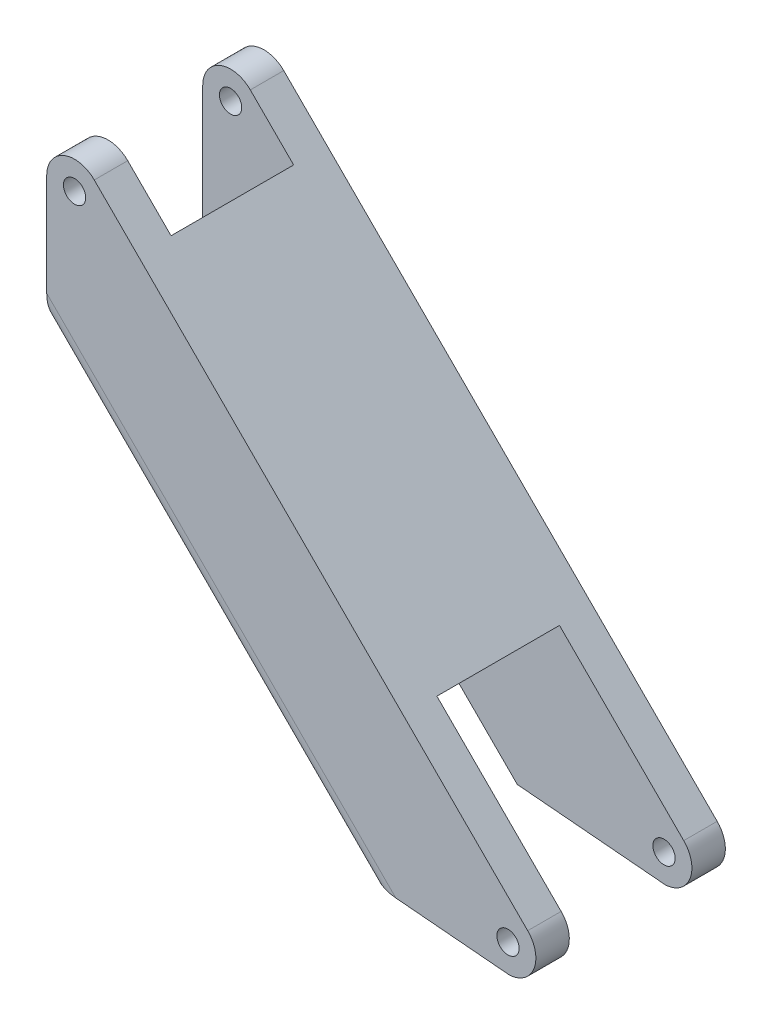
ISO-10303-21;
HEADER;
FILE_DESCRIPTION(('STEP AP214'),'2;1');
FILE_NAME('part.step','',(''),(''),'','','');
FILE_SCHEMA(('AUTOMOTIVE_DESIGN { 1 0 10303 214 1 1 1 1 }'));
ENDSEC;
DATA;
#1=APPLICATION_CONTEXT('core data for automotive mechanical design processes');
#2=APPLICATION_PROTOCOL_DEFINITION('international standard','automotive_design',2000,#1);
#3=PRODUCT_CONTEXT('',#1,'mechanical');
#4=PRODUCT('Part','Part','',(#3));
#5=PRODUCT_RELATED_PRODUCT_CATEGORY('part','',(#4));
#6=PRODUCT_DEFINITION_FORMATION('','',#4);
#7=PRODUCT_DEFINITION_CONTEXT('part definition',#1,'design');
#8=PRODUCT_DEFINITION('design','',#6,#7);
#9=PRODUCT_DEFINITION_SHAPE('','',#8);
#10=(LENGTH_UNIT() NAMED_UNIT(*) SI_UNIT(.MILLI.,.METRE.));
#11=(NAMED_UNIT(*) PLANE_ANGLE_UNIT() SI_UNIT($,.RADIAN.));
#12=(NAMED_UNIT(*) SI_UNIT($,.STERADIAN.) SOLID_ANGLE_UNIT());
#13=UNCERTAINTY_MEASURE_WITH_UNIT(LENGTH_MEASURE(1.E-05),#10,'distance_accuracy_value','');
#14=(GEOMETRIC_REPRESENTATION_CONTEXT(3) GLOBAL_UNCERTAINTY_ASSIGNED_CONTEXT((#13)) GLOBAL_UNIT_ASSIGNED_CONTEXT((#10,
#11,#12)) REPRESENTATION_CONTEXT('',''));
#15=CARTESIAN_POINT('',(0.,0.,0.));
#16=DIRECTION('',(0.,0.,1.));
#17=DIRECTION('',(1.,0.,0.));
#18=AXIS2_PLACEMENT_3D('',#15,#16,#17);
#19=CARTESIAN_POINT('',(-18.6655365987259,0.,17.));
#20=DIRECTION('',(1.,0.,0.));
#21=DIRECTION('',(0.,1.,0.));
#22=AXIS2_PLACEMENT_3D('',#19,#20,#21);
#23=PLANE('',#22);
#24=DIRECTION('',(0.,-1.,0.));
#25=VECTOR('',#24,1.);
#26=CARTESIAN_POINT('',(-18.6655365987259,0.,0.));
#27=LINE('',#26,#25);
#28=CARTESIAN_POINT('',(-18.6655365987259,52.9408964097891,0.));
#29=VERTEX_POINT('',#28);
#30=CARTESIAN_POINT('',(-18.6655365987259,43.7693235345353,0.));
#31=VERTEX_POINT('',#30);
#32=EDGE_CURVE('E257',#29,#31,#27,.T.);
#33=ORIENTED_EDGE('',*,*,#32,.T.);
#34=CARTESIAN_POINT('',(-18.6655365987259,43.7693235345353,2.));
#35=DIRECTION('',(1.,0.,0.));
#36=DIRECTION('',(0.,-1.,0.));
#37=AXIS2_PLACEMENT_3D('',#34,#35,#36);
#38=ELLIPSE('',#37,2.82842712474618,2.);
#39=CARTESIAN_POINT('',(-18.6655365987259,40.9408964097891,2.));
#40=VERTEX_POINT('',#39);
#41=EDGE_CURVE('E13',#31,#40,#38,.F.);
#42=ORIENTED_EDGE('',*,*,#41,.T.);
#43=DIRECTION('',(0.,0.,-1.));
#44=VECTOR('',#43,1.);
#45=CARTESIAN_POINT('',(-18.6655365987259,40.9408964097891,17.));
#46=LINE('',#45,#44);
#47=CARTESIAN_POINT('',(-18.6655365987259,40.9408964097891,3.));
#48=VERTEX_POINT('',#47);
#49=EDGE_CURVE('E294',#48,#40,#46,.T.);
#50=ORIENTED_EDGE('',*,*,#49,.F.);
#51=DIRECTION('',(0.,1.,0.));
#52=VECTOR('',#51,1.);
#53=CARTESIAN_POINT('',(-18.6655365987259,0.,3.));
#54=LINE('',#53,#52);
#55=CARTESIAN_POINT('',(-18.6655365987259,52.9408964097891,3.));
#56=VERTEX_POINT('',#55);
#57=EDGE_CURVE('E239',#48,#56,#54,.T.);
#58=ORIENTED_EDGE('',*,*,#57,.T.);
#59=DIRECTION('',(0.,0.,-1.));
#60=VECTOR('',#59,1.);
#61=CARTESIAN_POINT('',(-18.6655365987259,52.9408964097891,17.));
#62=LINE('',#61,#60);
#63=EDGE_CURVE('E297',#56,#29,#62,.T.);
#64=ORIENTED_EDGE('',*,*,#63,.T.);
#65=EDGE_LOOP('',(#33,#42,#50,#58,#64));
#66=FACE_BOUND('',#65,.T.);
#67=ADVANCED_FACE('F49',(#66),#23,.F.);
#68=CARTESIAN_POINT('',(11.1376799055317,11.1376799055318,17.));
#69=DIRECTION('',(0.707106781186544,0.707106781186551,0.));
#70=DIRECTION('',(-0.707106781186551,0.707106781186544,0.));
#71=AXIS2_PLACEMENT_3D('',#68,#69,#70);
#72=PLANE('',#71);
#73=ORIENTED_EDGE('',*,*,#49,.T.);
#74=DIRECTION('',(0.707106781186551,-0.707106781186544,0.));
#75=VECTOR('',#74,1.);
#76=CARTESIAN_POINT('',(11.1376799055317,11.1376799055318,2.));
#77=LINE('',#76,#75);
#78=CARTESIAN_POINT('',(9.56111441971268,12.7142453913509,2.));
#79=VERTEX_POINT('',#78);
#80=EDGE_CURVE('E331',#40,#79,#77,.T.);
#81=ORIENTED_EDGE('',*,*,#80,.T.);
#82=DIRECTION('',(0.,0.,-1.));
#83=VECTOR('',#82,1.);
#84=CARTESIAN_POINT('',(9.56111441971268,12.7142453913509,17.));
#85=LINE('',#84,#83);
#86=CARTESIAN_POINT('',(9.56111441971265,12.7142453913509,3.));
#87=VERTEX_POINT('',#86);
#88=EDGE_CURVE('E274',#87,#79,#85,.T.);
#89=ORIENTED_EDGE('',*,*,#88,.F.);
#90=DIRECTION('',(-0.707106781186551,0.707106781186544,0.));
#91=VECTOR('',#90,1.);
#92=CARTESIAN_POINT('',(11.1376799055317,11.1376799055318,3.));
#93=LINE('',#92,#91);
#94=EDGE_CURVE('E313',#87,#48,#93,.T.);
#95=ORIENTED_EDGE('',*,*,#94,.T.);
#96=EDGE_LOOP('',(#73,#81,#89,#95));
#97=FACE_BOUND('',#96,.T.);
#98=ADVANCED_FACE('F338',(#97),#72,.F.);
#99=CARTESIAN_POINT('',(1.17653017718053,13.4478014609505,17.));
#100=DIRECTION('',(-0.0871557427476584,-0.996194698091746,0.));
#101=DIRECTION('',(0.996194698091746,-0.0871557427476584,0.));
#102=AXIS2_PLACEMENT_3D('',#99,#100,#101);
#103=PLANE('',#102);
#104=DIRECTION('',(-0.996194698091746,0.0871557427476584,0.));
#105=VECTOR('',#104,1.);
#106=CARTESIAN_POINT('',(1.17653017718053,13.4478014609505,17.));
#107=LINE('',#106,#105);
#108=CARTESIAN_POINT('',(22.8387913795427,11.5525991794064,17.));
#109=VERTEX_POINT('',#108);
#110=CARTESIAN_POINT('',(12.6607220757394,12.4430648600704,17.));
#111=VERTEX_POINT('',#110);
#112=EDGE_CURVE('E260',#109,#111,#107,.T.);
#113=ORIENTED_EDGE('',*,*,#112,.T.);
#114=CARTESIAN_POINT('',(12.6607220757394,12.4430648600704,15.));
#115=DIRECTION('',(-0.0871557427476584,-0.996194698091746,0.));
#116=DIRECTION('',(-0.996194698091746,0.0871557427476584,0.));
#117=AXIS2_PLACEMENT_3D('',#114,#115,#116);
#118=ELLIPSE('',#117,3.11144765372084,2.);
#119=CARTESIAN_POINT('',(9.56111441971268,12.7142453913509,15.));
#120=VERTEX_POINT('',#119);
#121=EDGE_CURVE('E325',#111,#120,#118,.T.);
#122=ORIENTED_EDGE('',*,*,#121,.T.);
#123=CARTESIAN_POINT('',(9.56111441971265,12.7142453913509,14.));
#124=VERTEX_POINT('',#123);
#125=EDGE_CURVE('E292',#120,#124,#85,.T.);
#126=ORIENTED_EDGE('',*,*,#125,.T.);
#127=DIRECTION('',(-0.996194698091746,0.0871557427476584,0.));
#128=VECTOR('',#127,1.);
#129=CARTESIAN_POINT('',(1.17653017718053,13.4478014609505,14.));
#130=LINE('',#129,#128);
#131=CARTESIAN_POINT('',(22.8387913795427,11.5525991794064,14.));
#132=VERTEX_POINT('',#131);
#133=EDGE_CURVE('E229',#132,#124,#130,.T.);
#134=ORIENTED_EDGE('',*,*,#133,.F.);
#135=DIRECTION('',(0.,0.,-1.));
#136=VECTOR('',#135,1.);
#137=CARTESIAN_POINT('',(22.8387913795427,11.5525991794064,17.));
#138=LINE('',#137,#136);
#139=EDGE_CURVE('E310',#109,#132,#138,.T.);
#140=ORIENTED_EDGE('',*,*,#139,.F.);
#141=EDGE_LOOP('',(#113,#122,#126,#134,#140));
#142=FACE_BOUND('',#141,.T.);
#143=ADVANCED_FACE('F406',(#142),#103,.T.);
#144=CARTESIAN_POINT('',(22.7253363665345,14.0500234445292,17.));
#145=DIRECTION('',(0.,0.,-1.));
#146=DIRECTION('',(-1.,0.,0.));
#147=AXIS2_PLACEMENT_3D('',#144,#145,#146);
#148=CYLINDRICAL_SURFACE('',#147,2.50000000000023);
#149=ORIENTED_EDGE('',*,*,#139,.T.);
#150=CARTESIAN_POINT('',(22.7253363665345,14.0500234445292,14.));
#151=DIRECTION('',(0.,0.,1.));
#152=DIRECTION('',(1.,0.,0.));
#153=AXIS2_PLACEMENT_3D('',#150,#151,#152);
#154=CIRCLE('',#153,2.50000000000023);
#155=CARTESIAN_POINT('',(24.4931033195011,15.8177903974958,14.));
#156=VERTEX_POINT('',#155);
#157=EDGE_CURVE('E232',#132,#156,#154,.T.);
#158=ORIENTED_EDGE('',*,*,#157,.T.);
#159=DIRECTION('',(0.,0.,-1.));
#160=VECTOR('',#159,1.);
#161=CARTESIAN_POINT('',(24.4931033195011,15.8177903974958,17.));
#162=LINE('',#161,#160);
#163=CARTESIAN_POINT('',(24.4931033195011,15.8177903974958,17.));
#164=VERTEX_POINT('',#163);
#165=EDGE_CURVE('E306',#164,#156,#162,.T.);
#166=ORIENTED_EDGE('',*,*,#165,.F.);
#167=CARTESIAN_POINT('',(22.7253363665345,14.0500234445292,17.));
#168=DIRECTION('',(0.,0.,1.));
#169=DIRECTION('',(1.,0.,0.));
#170=AXIS2_PLACEMENT_3D('',#167,#168,#169);
#171=CIRCLE('',#170,2.50000000000023);
#172=EDGE_CURVE('E263',#109,#164,#171,.T.);
#173=ORIENTED_EDGE('',*,*,#172,.F.);
#174=EDGE_LOOP('',(#149,#158,#166,#173));
#175=FACE_BOUND('',#174,.T.);
#176=ADVANCED_FACE('F437',(#175),#148,.T.);
#177=CARTESIAN_POINT('',(-16.1655365987258,52.9408964097891,17.));
#178=DIRECTION('',(0.,0.,-1.));
#179=DIRECTION('',(-1.,0.,0.));
#180=AXIS2_PLACEMENT_3D('',#177,#178,#179);
#181=CYLINDRICAL_SURFACE('',#180,2.5000000000001);
#182=DIRECTION('',(0.,0.,-1.));
#183=VECTOR('',#182,1.);
#184=CARTESIAN_POINT('',(-14.3977696457594,54.7086633627556,17.));
#185=LINE('',#184,#183);
#186=CARTESIAN_POINT('',(-14.3977696457594,54.7086633627556,17.));
#187=VERTEX_POINT('',#186);
#188=CARTESIAN_POINT('',(-14.3977696457593,54.7086633627557,14.));
#189=VERTEX_POINT('',#188);
#190=EDGE_CURVE('E302',#187,#189,#185,.T.);
#191=ORIENTED_EDGE('',*,*,#190,.T.);
#192=CARTESIAN_POINT('',(-16.1655365987258,52.9408964097891,14.));
#193=DIRECTION('',(0.,0.,1.));
#194=DIRECTION('',(1.,0.,0.));
#195=AXIS2_PLACEMENT_3D('',#192,#193,#194);
#196=CIRCLE('',#195,2.5000000000001);
#197=CARTESIAN_POINT('',(-18.6655365987259,52.9408964097891,14.));
#198=VERTEX_POINT('',#197);
#199=EDGE_CURVE('E249',#189,#198,#196,.T.);
#200=ORIENTED_EDGE('',*,*,#199,.T.);
#201=CARTESIAN_POINT('',(-18.6655365987259,52.9408964097891,17.));
#202=VERTEX_POINT('',#201);
#203=EDGE_CURVE('E298',#202,#198,#62,.T.);
#204=ORIENTED_EDGE('',*,*,#203,.F.);
#205=CARTESIAN_POINT('',(-16.1655365987258,52.9408964097891,17.));
#206=DIRECTION('',(0.,0.,1.));
#207=DIRECTION('',(1.,0.,0.));
#208=AXIS2_PLACEMENT_3D('',#205,#206,#207);
#209=CIRCLE('',#208,2.5000000000001);
#210=EDGE_CURVE('E268',#187,#202,#209,.T.);
#211=ORIENTED_EDGE('',*,*,#210,.F.);
#212=EDGE_LOOP('',(#191,#200,#204,#211));
#213=FACE_BOUND('',#212,.T.);
#214=ADVANCED_FACE('F421',(#213),#181,.T.);
#215=CARTESIAN_POINT('',(22.7253363665345,14.0500234445292,17.));
#216=DIRECTION('',(0.,0.,-1.));
#217=DIRECTION('',(-1.,0.,0.));
#218=AXIS2_PLACEMENT_3D('',#215,#216,#217);
#219=CYLINDRICAL_SURFACE('',#218,1.);
#220=CARTESIAN_POINT('',(22.7253363665345,14.0500234445292,14.));
#221=DIRECTION('',(0.,0.,1.));
#222=DIRECTION('',(1.,0.,0.));
#223=AXIS2_PLACEMENT_3D('',#220,#221,#222);
#224=CIRCLE('',#223,1.);
#225=CARTESIAN_POINT('',(23.7253363665345,14.0500234445292,14.));
#226=VERTEX_POINT('',#225);
#227=EDGE_CURVE('E235',#226,#226,#224,.T.);
#228=ORIENTED_EDGE('',*,*,#227,.F.);
#229=EDGE_LOOP('',(#228));
#230=FACE_BOUND('',#229,.T.);
#231=CARTESIAN_POINT('',(22.7253363665345,14.0500234445292,17.));
#232=DIRECTION('',(0.,0.,1.));
#233=DIRECTION('',(1.,0.,0.));
#234=AXIS2_PLACEMENT_3D('',#231,#232,#233);
#235=CIRCLE('',#234,1.);
#236=CARTESIAN_POINT('',(23.7253363665345,14.0500234445292,17.));
#237=VERTEX_POINT('',#236);
#238=EDGE_CURVE('E256',#237,#237,#235,.T.);
#239=ORIENTED_EDGE('',*,*,#238,.T.);
#240=EDGE_LOOP('',(#239));
#241=FACE_BOUND('',#240,.T.);
#242=ADVANCED_FACE('F420',(#230,#241),#219,.F.);
#243=CARTESIAN_POINT('',(-16.1655365987258,52.9408964097891,17.));
#244=DIRECTION('',(0.,0.,-1.));
#245=DIRECTION('',(-1.,0.,0.));
#246=AXIS2_PLACEMENT_3D('',#243,#244,#245);
#247=CYLINDRICAL_SURFACE('',#246,1.00000000000001);
#248=CARTESIAN_POINT('',(-16.1655365987258,52.9408964097891,14.));
#249=DIRECTION('',(0.,0.,1.));
#250=DIRECTION('',(1.,0.,0.));
#251=AXIS2_PLACEMENT_3D('',#248,#249,#250);
#252=CIRCLE('',#251,1.00000000000001);
#253=CARTESIAN_POINT('',(-15.1655365987258,52.9408964097891,14.));
#254=VERTEX_POINT('',#253);
#255=EDGE_CURVE('E245',#254,#254,#252,.T.);
#256=ORIENTED_EDGE('',*,*,#255,.F.);
#257=EDGE_LOOP('',(#256));
#258=FACE_BOUND('',#257,.T.);
#259=CARTESIAN_POINT('',(-16.1655365987258,52.9408964097891,17.));
#260=DIRECTION('',(0.,0.,1.));
#261=DIRECTION('',(1.,0.,0.));
#262=AXIS2_PLACEMENT_3D('',#259,#260,#261);
#263=CIRCLE('',#262,1.00000000000001);
#264=CARTESIAN_POINT('',(-15.1655365987258,52.9408964097891,17.));
#265=VERTEX_POINT('',#264);
#266=EDGE_CURVE('E253',#265,#265,#263,.T.);
#267=ORIENTED_EDGE('',*,*,#266,.T.);
#268=EDGE_LOOP('',(#267));
#269=FACE_BOUND('',#268,.T.);
#270=ADVANCED_FACE('F451',(#258,#269),#247,.F.);
#271=ORIENTED_EDGE('',*,*,#88,.T.);
#272=CARTESIAN_POINT('',(12.6607220757394,12.4430648600704,2.));
#273=DIRECTION('',(-0.0871557427476584,-0.996194698091746,0.));
#274=DIRECTION('',(0.996194698091746,-0.0871557427476584,0.));
#275=AXIS2_PLACEMENT_3D('',#272,#273,#274);
#276=ELLIPSE('',#275,3.11144765372084,2.);
#277=CARTESIAN_POINT('',(12.6607220757394,12.4430648600704,0.));
#278=VERTEX_POINT('',#277);
#279=EDGE_CURVE('E71',#79,#278,#276,.T.);
#280=ORIENTED_EDGE('',*,*,#279,.T.);
#281=DIRECTION('',(-0.996194698091746,0.0871557427476584,0.));
#282=VECTOR('',#281,1.);
#283=CARTESIAN_POINT('',(1.17653017718053,13.4478014609505,0.));
#284=LINE('',#283,#282);
#285=CARTESIAN_POINT('',(22.8387913795427,11.5525991794064,0.));
#286=VERTEX_POINT('',#285);
#287=EDGE_CURVE('E280',#286,#278,#284,.T.);
#288=ORIENTED_EDGE('',*,*,#287,.F.);
#289=CARTESIAN_POINT('',(22.8387913795427,11.5525991794064,3.));
#290=VERTEX_POINT('',#289);
#291=EDGE_CURVE('E309',#290,#286,#138,.T.);
#292=ORIENTED_EDGE('',*,*,#291,.F.);
#293=DIRECTION('',(0.996194698091746,-0.0871557427476584,0.));
#294=VECTOR('',#293,1.);
#295=CARTESIAN_POINT('',(1.17653017718053,13.4478014609505,3.));
#296=LINE('',#295,#294);
#297=EDGE_CURVE('E220',#87,#290,#296,.T.);
#298=ORIENTED_EDGE('',*,*,#297,.F.);
#299=EDGE_LOOP('',(#271,#280,#288,#292,#298));
#300=FACE_BOUND('',#299,.T.);
#301=ADVANCED_FACE('F343',(#300),#103,.T.);
#302=CARTESIAN_POINT('',(24.4931033195011,15.8177903974958,3.));
#303=VERTEX_POINT('',#302);
#304=CARTESIAN_POINT('',(24.4931033195011,15.8177903974958,0.));
#305=VERTEX_POINT('',#304);
#306=EDGE_CURVE('E305',#303,#305,#162,.T.);
#307=ORIENTED_EDGE('',*,*,#306,.F.);
#308=CARTESIAN_POINT('',(22.7253363665345,14.0500234445292,3.));
#309=DIRECTION('',(0.,0.,-1.));
#310=DIRECTION('',(-1.,0.,0.));
#311=AXIS2_PLACEMENT_3D('',#308,#309,#310);
#312=CIRCLE('',#311,2.50000000000023);
#313=EDGE_CURVE('E222',#303,#290,#312,.T.);
#314=ORIENTED_EDGE('',*,*,#313,.T.);
#315=ORIENTED_EDGE('',*,*,#291,.T.);
#316=CARTESIAN_POINT('',(22.7253363665345,14.0500234445292,0.));
#317=DIRECTION('',(0.,0.,1.));
#318=DIRECTION('',(1.,0.,0.));
#319=AXIS2_PLACEMENT_3D('',#316,#317,#318);
#320=CIRCLE('',#319,2.50000000000023);
#321=EDGE_CURVE('E282',#286,#305,#320,.T.);
#322=ORIENTED_EDGE('',*,*,#321,.T.);
#323=EDGE_LOOP('',(#307,#314,#315,#322));
#324=FACE_BOUND('',#323,.T.);
#325=ADVANCED_FACE('F352',(#324),#148,.T.);
#326=CARTESIAN_POINT('',(20.1554468584983,20.1554468584985,17.));
#327=DIRECTION('',(0.707106781186544,0.707106781186552,0.));
#328=DIRECTION('',(-0.707106781186551,0.707106781186544,0.));
#329=AXIS2_PLACEMENT_3D('',#326,#327,#328);
#330=PLANE('',#329);
#331=DIRECTION('',(0.707106781186551,-0.707106781186543,0.));
#332=VECTOR('',#331,1.);
#333=CARTESIAN_POINT('',(2.19403787867576,38.1168558383208,14.));
#334=LINE('',#333,#332);
#335=CARTESIAN_POINT('',(13.3435705990884,26.9673231179083,14.));
#336=VERTEX_POINT('',#335);
#337=EDGE_CURVE('E214',#336,#156,#334,.T.);
#338=ORIENTED_EDGE('',*,*,#337,.F.);
#339=DIRECTION('',(0.,0.,-1.));
#340=VECTOR('',#339,1.);
#341=CARTESIAN_POINT('',(13.3435705990884,26.9673231179083,3.));
#342=LINE('',#341,#340);
#343=CARTESIAN_POINT('',(13.3435705990884,26.9673231179083,3.));
#344=VERTEX_POINT('',#343);
#345=EDGE_CURVE('E361',#336,#344,#342,.T.);
#346=ORIENTED_EDGE('',*,*,#345,.T.);
#347=DIRECTION('',(-0.707106781186552,0.707106781186543,0.));
#348=VECTOR('',#347,1.);
#349=CARTESIAN_POINT('',(4.31535822223541,35.9955354947612,3.));
#350=LINE('',#349,#348);
#351=EDGE_CURVE('E212',#303,#344,#350,.T.);
#352=ORIENTED_EDGE('',*,*,#351,.F.);
#353=ORIENTED_EDGE('',*,*,#306,.T.);
#354=DIRECTION('',(0.707106781186551,-0.707106781186544,0.));
#355=VECTOR('',#354,1.);
#356=CARTESIAN_POINT('',(20.1554468584983,20.1554468584985,0.));
#357=LINE('',#356,#355);
#358=CARTESIAN_POINT('',(-14.3977696457594,54.7086633627556,0.));
#359=VERTEX_POINT('',#358);
#360=EDGE_CURVE('E285',#359,#305,#357,.T.);
#361=ORIENTED_EDGE('',*,*,#360,.F.);
#362=CARTESIAN_POINT('',(-14.3977696457593,54.7086633627557,3.));
#363=VERTEX_POINT('',#362);
#364=EDGE_CURVE('E301',#363,#359,#185,.T.);
#365=ORIENTED_EDGE('',*,*,#364,.F.);
#366=DIRECTION('',(-0.707106781186552,0.707106781186543,0.));
#367=VECTOR('',#366,1.);
#368=CARTESIAN_POINT('',(-10.5089841253068,50.8198778423033,3.));
#369=LINE('',#368,#367);
#370=CARTESIAN_POINT('',(-10.5089841253068,50.8198778423033,3.));
#371=VERTEX_POINT('',#370);
#372=EDGE_CURVE('E385',#371,#363,#369,.T.);
#373=ORIENTED_EDGE('',*,*,#372,.F.);
#374=DIRECTION('',(0.,0.,-1.));
#375=VECTOR('',#374,1.);
#376=CARTESIAN_POINT('',(-10.5089841253068,50.8198778423033,14.));
#377=LINE('',#376,#375);
#378=CARTESIAN_POINT('',(-10.5089841253068,50.8198778423033,14.));
#379=VERTEX_POINT('',#378);
#380=EDGE_CURVE('E378',#379,#371,#377,.T.);
#381=ORIENTED_EDGE('',*,*,#380,.F.);
#382=DIRECTION('',(0.707106781186552,-0.707106781186543,0.));
#383=VECTOR('',#382,1.);
#384=CARTESIAN_POINT('',(-22.7633573896774,63.0742511066737,14.));
#385=LINE('',#384,#383);
#386=EDGE_CURVE('E210',#189,#379,#385,.T.);
#387=ORIENTED_EDGE('',*,*,#386,.F.);
#388=ORIENTED_EDGE('',*,*,#190,.F.);
#389=DIRECTION('',(0.707106781186551,-0.707106781186544,0.));
#390=VECTOR('',#389,1.);
#391=CARTESIAN_POINT('',(20.1554468584983,20.1554468584985,17.));
#392=LINE('',#391,#390);
#393=EDGE_CURVE('E265',#187,#164,#392,.T.);
#394=ORIENTED_EDGE('',*,*,#393,.T.);
#395=ORIENTED_EDGE('',*,*,#165,.T.);
#396=EDGE_LOOP('',(#338,#346,#352,#353,#361,#365,#373,#381,#387,#388,#394,#395));
#397=FACE_BOUND('',#396,.T.);
#398=ADVANCED_FACE('F357',(#397),#330,.T.);
#399=ORIENTED_EDGE('',*,*,#63,.F.);
#400=CARTESIAN_POINT('',(-16.1655365987258,52.9408964097891,3.));
#401=DIRECTION('',(0.,0.,-1.));
#402=DIRECTION('',(-1.,0.,0.));
#403=AXIS2_PLACEMENT_3D('',#400,#401,#402);
#404=CIRCLE('',#403,2.5000000000001);
#405=EDGE_CURVE('E242',#56,#363,#404,.T.);
#406=ORIENTED_EDGE('',*,*,#405,.T.);
#407=ORIENTED_EDGE('',*,*,#364,.T.);
#408=CARTESIAN_POINT('',(-16.1655365987258,52.9408964097891,0.));
#409=DIRECTION('',(0.,0.,1.));
#410=DIRECTION('',(1.,0.,0.));
#411=AXIS2_PLACEMENT_3D('',#408,#409,#410);
#412=CIRCLE('',#411,2.5000000000001);
#413=EDGE_CURVE('E288',#359,#29,#412,.T.);
#414=ORIENTED_EDGE('',*,*,#413,.T.);
#415=EDGE_LOOP('',(#399,#406,#407,#414));
#416=FACE_BOUND('',#415,.T.);
#417=ADVANCED_FACE('F389',(#416),#181,.T.);
#418=CARTESIAN_POINT('',(-18.6655365987259,40.9408964097891,15.));
#419=VERTEX_POINT('',#418);
#420=CARTESIAN_POINT('',(-18.6655365987259,40.9408964097891,14.));
#421=VERTEX_POINT('',#420);
#422=EDGE_CURVE('E295',#419,#421,#46,.T.);
#423=ORIENTED_EDGE('',*,*,#422,.F.);
#424=CARTESIAN_POINT('',(-18.6655365987259,43.7693235345353,15.));
#425=DIRECTION('',(1.,0.,0.));
#426=DIRECTION('',(0.,1.,0.));
#427=AXIS2_PLACEMENT_3D('',#424,#425,#426);
#428=ELLIPSE('',#427,2.82842712474618,2.);
#429=CARTESIAN_POINT('',(-18.6655365987259,43.7693235345353,17.));
#430=VERTEX_POINT('',#429);
#431=EDGE_CURVE('E329',#419,#430,#428,.F.);
#432=ORIENTED_EDGE('',*,*,#431,.T.);
#433=DIRECTION('',(0.,-1.,0.));
#434=VECTOR('',#433,1.);
#435=CARTESIAN_POINT('',(-18.6655365987259,0.,17.));
#436=LINE('',#435,#434);
#437=EDGE_CURVE('E271',#202,#430,#436,.T.);
#438=ORIENTED_EDGE('',*,*,#437,.F.);
#439=ORIENTED_EDGE('',*,*,#203,.T.);
#440=DIRECTION('',(0.,-1.,0.));
#441=VECTOR('',#440,1.);
#442=CARTESIAN_POINT('',(-18.6655365987259,0.,14.));
#443=LINE('',#442,#441);
#444=EDGE_CURVE('E246',#198,#421,#443,.T.);
#445=ORIENTED_EDGE('',*,*,#444,.T.);
#446=EDGE_LOOP('',(#423,#432,#438,#439,#445));
#447=FACE_BOUND('',#446,.T.);
#448=ADVANCED_FACE('F402',(#447),#23,.F.);
#449=CARTESIAN_POINT('',(22.7253363665345,14.0500234445292,3.));
#450=DIRECTION('',(0.,0.,-1.));
#451=DIRECTION('',(-1.,0.,0.));
#452=AXIS2_PLACEMENT_3D('',#449,#450,#451);
#453=CIRCLE('',#452,1.);
#454=CARTESIAN_POINT('',(21.7253363665345,14.0500234445292,3.));
#455=VERTEX_POINT('',#454);
#456=EDGE_CURVE('E226',#455,#455,#453,.T.);
#457=ORIENTED_EDGE('',*,*,#456,.F.);
#458=EDGE_LOOP('',(#457));
#459=FACE_BOUND('',#458,.T.);
#460=CARTESIAN_POINT('',(22.7253363665345,14.0500234445292,0.));
#461=DIRECTION('',(0.,0.,1.));
#462=DIRECTION('',(1.,0.,0.));
#463=AXIS2_PLACEMENT_3D('',#460,#461,#462);
#464=CIRCLE('',#463,1.);
#465=CARTESIAN_POINT('',(23.7253363665345,14.0500234445292,0.));
#466=VERTEX_POINT('',#465);
#467=EDGE_CURVE('E277',#466,#466,#464,.T.);
#468=ORIENTED_EDGE('',*,*,#467,.F.);
#469=EDGE_LOOP('',(#468));
#470=FACE_BOUND('',#469,.T.);
#471=ADVANCED_FACE('F411',(#459,#470),#219,.F.);
#472=CARTESIAN_POINT('',(-16.1655365987258,52.9408964097891,3.));
#473=DIRECTION('',(0.,0.,-1.));
#474=DIRECTION('',(-1.,0.,0.));
#475=AXIS2_PLACEMENT_3D('',#472,#473,#474);
#476=CIRCLE('',#475,1.00000000000001);
#477=CARTESIAN_POINT('',(-17.1655365987258,52.9408964097891,3.));
#478=VERTEX_POINT('',#477);
#479=EDGE_CURVE('E238',#478,#478,#476,.T.);
#480=ORIENTED_EDGE('',*,*,#479,.F.);
#481=EDGE_LOOP('',(#480));
#482=FACE_BOUND('',#481,.T.);
#483=CARTESIAN_POINT('',(-16.1655365987258,52.9408964097891,0.));
#484=DIRECTION('',(0.,0.,1.));
#485=DIRECTION('',(1.,0.,0.));
#486=AXIS2_PLACEMENT_3D('',#483,#484,#485);
#487=CIRCLE('',#486,1.00000000000001);
#488=CARTESIAN_POINT('',(-15.1655365987258,52.9408964097891,0.));
#489=VERTEX_POINT('',#488);
#490=EDGE_CURVE('E252',#489,#489,#487,.T.);
#491=ORIENTED_EDGE('',*,*,#490,.F.);
#492=EDGE_LOOP('',(#491));
#493=FACE_BOUND('',#492,.T.);
#494=ADVANCED_FACE('F417',(#482,#493),#247,.F.);
#495=ORIENTED_EDGE('',*,*,#125,.F.);
#496=DIRECTION('',(0.707106781186551,-0.707106781186544,0.));
#497=VECTOR('',#496,1.);
#498=CARTESIAN_POINT('',(-18.6655365987259,40.9408964097891,15.));
#499=LINE('',#498,#497);
#500=EDGE_CURVE('E327',#120,#419,#499,.F.);
#501=ORIENTED_EDGE('',*,*,#500,.T.);
#502=ORIENTED_EDGE('',*,*,#422,.T.);
#503=DIRECTION('',(0.707106781186551,-0.707106781186544,0.));
#504=VECTOR('',#503,1.);
#505=CARTESIAN_POINT('',(11.1376799055317,11.1376799055318,14.));
#506=LINE('',#505,#504);
#507=EDGE_CURVE('E315',#421,#124,#506,.T.);
#508=ORIENTED_EDGE('',*,*,#507,.T.);
#509=EDGE_LOOP('',(#495,#501,#502,#508));
#510=FACE_BOUND('',#509,.T.);
#511=ADVANCED_FACE('F408',(#510),#72,.F.);
#512=CARTESIAN_POINT('',(0.,0.,17.));
#513=DIRECTION('',(0.,0.,1.));
#514=DIRECTION('',(1.,0.,0.));
#515=AXIS2_PLACEMENT_3D('',#512,#513,#514);
#516=PLANE('',#515);
#517=ORIENTED_EDGE('',*,*,#266,.F.);
#518=EDGE_LOOP('',(#517));
#519=FACE_BOUND('',#518,.T.);
#520=ORIENTED_EDGE('',*,*,#238,.F.);
#521=EDGE_LOOP('',(#520));
#522=FACE_BOUND('',#521,.T.);
#523=ORIENTED_EDGE('',*,*,#437,.T.);
#524=DIRECTION('',(0.707106781186551,-0.707106781186544,0.));
#525=VECTOR('',#524,1.);
#526=CARTESIAN_POINT('',(10.9753279820858,14.1284589537239,17.));
#527=LINE('',#526,#525);
#528=EDGE_CURVE('E318',#430,#111,#527,.T.);
#529=ORIENTED_EDGE('',*,*,#528,.T.);
#530=ORIENTED_EDGE('',*,*,#112,.F.);
#531=ORIENTED_EDGE('',*,*,#172,.T.);
#532=ORIENTED_EDGE('',*,*,#393,.F.);
#533=ORIENTED_EDGE('',*,*,#210,.T.);
#534=EDGE_LOOP('',(#523,#529,#530,#531,#532,#533));
#535=FACE_BOUND('',#534,.T.);
#536=ADVANCED_FACE('F430',(#519,#522,#535),#516,.T.);
#537=CARTESIAN_POINT('',(0.,0.,0.));
#538=DIRECTION('',(0.,0.,1.));
#539=DIRECTION('',(1.,0.,0.));
#540=AXIS2_PLACEMENT_3D('',#537,#538,#539);
#541=PLANE('',#540);
#542=ORIENTED_EDGE('',*,*,#490,.T.);
#543=EDGE_LOOP('',(#542));
#544=FACE_BOUND('',#543,.T.);
#545=ORIENTED_EDGE('',*,*,#467,.T.);
#546=EDGE_LOOP('',(#545));
#547=FACE_BOUND('',#546,.T.);
#548=ORIENTED_EDGE('',*,*,#287,.T.);
#549=DIRECTION('',(0.707106781186551,-0.707106781186544,0.));
#550=VECTOR('',#549,1.);
#551=CARTESIAN_POINT('',(12.5518934679048,12.5518934679049,0.));
#552=LINE('',#551,#550);
#553=EDGE_CURVE('E57',#278,#31,#552,.F.);
#554=ORIENTED_EDGE('',*,*,#553,.T.);
#555=ORIENTED_EDGE('',*,*,#32,.F.);
#556=ORIENTED_EDGE('',*,*,#413,.F.);
#557=ORIENTED_EDGE('',*,*,#360,.T.);
#558=ORIENTED_EDGE('',*,*,#321,.F.);
#559=EDGE_LOOP('',(#548,#554,#555,#556,#557,#558));
#560=FACE_BOUND('',#559,.T.);
#561=ADVANCED_FACE('F392',(#544,#547,#560),#541,.F.);
#562=CARTESIAN_POINT('',(-9.82677740149548,26.0960405581494,14.));
#563=DIRECTION('',(0.,0.,1.));
#564=DIRECTION('',(1.,0.,0.));
#565=AXIS2_PLACEMENT_3D('',#562,#563,#564);
#566=PLANE('',#565);
#567=ORIENTED_EDGE('',*,*,#227,.T.);
#568=EDGE_LOOP('',(#567));
#569=FACE_BOUND('',#568,.T.);
#570=DIRECTION('',(0.707106781186551,-0.707106781186544,0.));
#571=VECTOR('',#570,1.);
#572=CARTESIAN_POINT('',(11.9293570367153,25.5531095555352,14.));
#573=LINE('',#572,#571);
#574=CARTESIAN_POINT('',(0.779824316302672,36.7026422759477,14.));
#575=VERTEX_POINT('',#574);
#576=CARTESIAN_POINT('',(11.9293570367153,25.5531095555352,14.));
#577=VERTEX_POINT('',#576);
#578=EDGE_CURVE('E478',#575,#577,#573,.T.);
#579=ORIENTED_EDGE('',*,*,#578,.T.);
#580=DIRECTION('',(0.707106781186543,0.707106781186552,0.));
#581=VECTOR('',#580,1.);
#582=CARTESIAN_POINT('',(11.9293570367153,25.5531095555352,14.));
#583=LINE('',#582,#581);
#584=EDGE_CURVE('E370',#577,#336,#583,.T.);
#585=ORIENTED_EDGE('',*,*,#584,.T.);
#586=ORIENTED_EDGE('',*,*,#337,.T.);
#587=ORIENTED_EDGE('',*,*,#157,.F.);
#588=ORIENTED_EDGE('',*,*,#133,.T.);
#589=ORIENTED_EDGE('',*,*,#507,.F.);
#590=ORIENTED_EDGE('',*,*,#444,.F.);
#591=ORIENTED_EDGE('',*,*,#199,.F.);
#592=ORIENTED_EDGE('',*,*,#386,.T.);
#593=DIRECTION('',(0.707106781186544,0.707106781186552,0.));
#594=VECTOR('',#593,1.);
#595=CARTESIAN_POINT('',(-22.5297994054781,38.7990625621319,14.));
#596=LINE('',#595,#594);
#597=CARTESIAN_POINT('',(-13.5267510782734,47.8021108893367,14.));
#598=VERTEX_POINT('',#597);
#599=EDGE_CURVE('E202',#598,#379,#596,.T.);
#600=ORIENTED_EDGE('',*,*,#599,.F.);
#601=DIRECTION('',(-0.707106781186551,0.707106781186544,0.));
#602=VECTOR('',#601,1.);
#603=CARTESIAN_POINT('',(23.9740484990961,10.3013113119677,14.));
#604=LINE('',#603,#602);
#605=CARTESIAN_POINT('',(-0.823729074290786,35.0990888853542,14.));
#606=VERTEX_POINT('',#605);
#607=EDGE_CURVE('E185',#606,#598,#604,.T.);
#608=ORIENTED_EDGE('',*,*,#607,.F.);
#609=DIRECTION('',(0.707106781186544,0.707106781186552,0.));
#610=VECTOR('',#609,1.);
#611=CARTESIAN_POINT('',(-9.82677740149548,26.0960405581494,14.));
#612=LINE('',#611,#610);
#613=EDGE_CURVE('E223',#606,#575,#612,.T.);
#614=ORIENTED_EDGE('',*,*,#613,.T.);
#615=EDGE_LOOP('',(#579,#585,#586,#587,#588,#589,#590,#591,#592,#600,#608,#614));
#616=FACE_BOUND('',#615,.T.);
#617=ORIENTED_EDGE('',*,*,#255,.T.);
#618=EDGE_LOOP('',(#617));
#619=FACE_BOUND('',#618,.T.);
#620=ADVANCED_FACE('F207',(#569,#616,#619),#566,.F.);
#621=CARTESIAN_POINT('',(-9.82677740149548,26.0960405581494,3.));
#622=DIRECTION('',(-0.707106781186552,0.707106781186544,0.));
#623=DIRECTION('',(-0.707106781186544,-0.707106781186552,0.));
#624=AXIS2_PLACEMENT_3D('',#621,#622,#623);
#625=PLANE('',#624);
#626=DIRECTION('',(0.707106781186544,0.707106781186552,0.));
#627=VECTOR('',#626,1.);
#628=CARTESIAN_POINT('',(-9.82677740149548,26.0960405581494,3.));
#629=LINE('',#628,#627);
#630=CARTESIAN_POINT('',(-0.823729074290791,35.0990888853542,3.));
#631=VERTEX_POINT('',#630);
#632=CARTESIAN_POINT('',(0.779824316302675,36.7026422759477,3.));
#633=VERTEX_POINT('',#632);
#634=EDGE_CURVE('E381',#631,#633,#629,.T.);
#635=ORIENTED_EDGE('',*,*,#634,.T.);
#636=DIRECTION('',(0.,0.,1.));
#637=VECTOR('',#636,1.);
#638=CARTESIAN_POINT('',(0.77982431630267,36.7026422759477,14.));
#639=LINE('',#638,#637);
#640=EDGE_CURVE('E372',#633,#575,#639,.T.);
#641=ORIENTED_EDGE('',*,*,#640,.T.);
#642=ORIENTED_EDGE('',*,*,#613,.F.);
#643=DIRECTION('',(0.,0.,-1.));
#644=VECTOR('',#643,1.);
#645=CARTESIAN_POINT('',(-0.823729074290784,35.0990888853542,3.));
#646=LINE('',#645,#644);
#647=EDGE_CURVE('E191',#606,#631,#646,.T.);
#648=ORIENTED_EDGE('',*,*,#647,.T.);
#649=EDGE_LOOP('',(#635,#641,#642,#648));
#650=FACE_BOUND('',#649,.T.);
#651=ADVANCED_FACE('F460',(#650),#625,.F.);
#652=CARTESIAN_POINT('',(-7.70545705793583,23.9747202145898,3.));
#653=DIRECTION('',(0.,0.,-1.));
#654=DIRECTION('',(-1.,0.,0.));
#655=AXIS2_PLACEMENT_3D('',#652,#653,#654);
#656=PLANE('',#655);
#657=ORIENTED_EDGE('',*,*,#456,.T.);
#658=EDGE_LOOP('',(#657));
#659=FACE_BOUND('',#658,.T.);
#660=ORIENTED_EDGE('',*,*,#351,.T.);
#661=DIRECTION('',(0.707106781186543,0.707106781186552,0.));
#662=VECTOR('',#661,1.);
#663=CARTESIAN_POINT('',(11.9293570367153,25.5531095555352,3.));
#664=LINE('',#663,#662);
#665=CARTESIAN_POINT('',(11.9293570367153,25.5531095555352,3.));
#666=VERTEX_POINT('',#665);
#667=EDGE_CURVE('E205',#666,#344,#664,.T.);
#668=ORIENTED_EDGE('',*,*,#667,.F.);
#669=DIRECTION('',(-0.707106781186551,0.707106781186544,0.));
#670=VECTOR('',#669,1.);
#671=CARTESIAN_POINT('',(0.77982431630267,36.7026422759477,3.));
#672=LINE('',#671,#670);
#673=EDGE_CURVE('E480',#666,#633,#672,.T.);
#674=ORIENTED_EDGE('',*,*,#673,.T.);
#675=ORIENTED_EDGE('',*,*,#634,.F.);
#676=DIRECTION('',(-0.707106781186551,0.707106781186544,0.));
#677=VECTOR('',#676,1.);
#678=CARTESIAN_POINT('',(23.9740484990961,10.3013113119677,3.));
#679=LINE('',#678,#677);
#680=CARTESIAN_POINT('',(-13.5267510782734,47.8021108893367,3.));
#681=VERTEX_POINT('',#680);
#682=EDGE_CURVE('E196',#631,#681,#679,.T.);
#683=ORIENTED_EDGE('',*,*,#682,.T.);
#684=DIRECTION('',(0.707106781186544,0.707106781186552,0.));
#685=VECTOR('',#684,1.);
#686=CARTESIAN_POINT('',(-22.5297994054781,38.7990625621319,3.));
#687=LINE('',#686,#685);
#688=EDGE_CURVE('E204',#681,#371,#687,.T.);
#689=ORIENTED_EDGE('',*,*,#688,.T.);
#690=ORIENTED_EDGE('',*,*,#372,.T.);
#691=ORIENTED_EDGE('',*,*,#405,.F.);
#692=ORIENTED_EDGE('',*,*,#57,.F.);
#693=ORIENTED_EDGE('',*,*,#94,.F.);
#694=ORIENTED_EDGE('',*,*,#297,.T.);
#695=ORIENTED_EDGE('',*,*,#313,.F.);
#696=EDGE_LOOP('',(#660,#668,#674,#675,#683,#689,#690,#691,#692,#693,#694,#695));
#697=FACE_BOUND('',#696,.T.);
#698=ORIENTED_EDGE('',*,*,#479,.T.);
#699=EDGE_LOOP('',(#698));
#700=FACE_BOUND('',#699,.T.);
#701=ADVANCED_FACE('F346',(#659,#697,#700),#656,.F.);
#702=CARTESIAN_POINT('',(-22.5297994054781,38.7990625621319,14.));
#703=DIRECTION('',(0.707106781186552,-0.707106781186544,0.));
#704=DIRECTION('',(0.707106781186544,0.707106781186552,0.));
#705=AXIS2_PLACEMENT_3D('',#702,#703,#704);
#706=PLANE('',#705);
#707=ORIENTED_EDGE('',*,*,#688,.F.);
#708=DIRECTION('',(0.,0.,-1.));
#709=VECTOR('',#708,1.);
#710=CARTESIAN_POINT('',(-13.5267510782734,47.8021108893367,3.));
#711=LINE('',#710,#709);
#712=EDGE_CURVE('E188',#598,#681,#711,.T.);
#713=ORIENTED_EDGE('',*,*,#712,.F.);
#714=ORIENTED_EDGE('',*,*,#599,.T.);
#715=ORIENTED_EDGE('',*,*,#380,.T.);
#716=EDGE_LOOP('',(#707,#713,#714,#715));
#717=FACE_BOUND('',#716,.T.);
#718=ADVANCED_FACE('F200',(#717),#706,.F.);
#719=CARTESIAN_POINT('',(23.9740484990961,10.3013113119677,3.));
#720=DIRECTION('',(0.707106781186544,0.707106781186551,0.));
#721=DIRECTION('',(-0.707106781186551,0.707106781186544,0.));
#722=AXIS2_PLACEMENT_3D('',#719,#720,#721);
#723=PLANE('',#722);
#724=ORIENTED_EDGE('',*,*,#607,.T.);
#725=ORIENTED_EDGE('',*,*,#712,.T.);
#726=ORIENTED_EDGE('',*,*,#682,.F.);
#727=ORIENTED_EDGE('',*,*,#647,.F.);
#728=EDGE_LOOP('',(#724,#725,#726,#727));
#729=FACE_BOUND('',#728,.T.);
#730=ADVANCED_FACE('F187',(#729),#723,.F.);
#731=CARTESIAN_POINT('',(11.9293570367153,25.5531095555352,3.));
#732=DIRECTION('',(0.707106781186552,-0.707106781186543,0.));
#733=DIRECTION('',(0.707106781186543,0.707106781186552,0.));
#734=AXIS2_PLACEMENT_3D('',#731,#732,#733);
#735=PLANE('',#734);
#736=ORIENTED_EDGE('',*,*,#345,.F.);
#737=ORIENTED_EDGE('',*,*,#584,.F.);
#738=DIRECTION('',(0.,0.,-1.));
#739=VECTOR('',#738,1.);
#740=CARTESIAN_POINT('',(11.9293570367153,25.5531095555352,3.));
#741=LINE('',#740,#739);
#742=EDGE_CURVE('E369',#577,#666,#741,.T.);
#743=ORIENTED_EDGE('',*,*,#742,.T.);
#744=ORIENTED_EDGE('',*,*,#667,.T.);
#745=EDGE_LOOP('',(#736,#737,#743,#744));
#746=FACE_BOUND('',#745,.T.);
#747=ADVANCED_FACE('F366',(#746),#735,.T.);
#748=CARTESIAN_POINT('',(18.7412332961252,18.7412332961254,0.));
#749=DIRECTION('',(-0.707106781186544,-0.707106781186551,0.));
#750=DIRECTION('',(0.707106781186551,-0.707106781186544,0.));
#751=AXIS2_PLACEMENT_3D('',#748,#749,#750);
#752=PLANE('',#751);
#753=ORIENTED_EDGE('',*,*,#578,.F.);
#754=ORIENTED_EDGE('',*,*,#640,.F.);
#755=ORIENTED_EDGE('',*,*,#673,.F.);
#756=ORIENTED_EDGE('',*,*,#742,.F.);
#757=EDGE_LOOP('',(#753,#754,#755,#756));
#758=FACE_BOUND('',#757,.T.);
#759=ADVANCED_FACE('F398',(#758),#752,.T.);
#760=CARTESIAN_POINT('',(12.5518934679048,12.5518934679049,15.));
#761=DIRECTION('',(-0.707106781186551,0.707106781186544,0.));
#762=DIRECTION('',(-0.707106781186544,-0.707106781186551,0.));
#763=AXIS2_PLACEMENT_3D('',#760,#761,#762);
#764=CYLINDRICAL_SURFACE('',#763,2.);
#765=ORIENTED_EDGE('',*,*,#431,.F.);
#766=ORIENTED_EDGE('',*,*,#500,.F.);
#767=ORIENTED_EDGE('',*,*,#121,.F.);
#768=ORIENTED_EDGE('',*,*,#528,.F.);
#769=EDGE_LOOP('',(#765,#766,#767,#768));
#770=FACE_BOUND('',#769,.T.);
#771=ADVANCED_FACE('F394',(#770),#764,.T.);
#772=CARTESIAN_POINT('',(12.5518934679048,12.5518934679049,2.));
#773=DIRECTION('',(0.707106781186551,-0.707106781186544,0.));
#774=DIRECTION('',(0.707106781186544,0.707106781186551,0.));
#775=AXIS2_PLACEMENT_3D('',#772,#773,#774);
#776=CYLINDRICAL_SURFACE('',#775,2.);
#777=ORIENTED_EDGE('',*,*,#41,.F.);
#778=ORIENTED_EDGE('',*,*,#553,.F.);
#779=ORIENTED_EDGE('',*,*,#279,.F.);
#780=ORIENTED_EDGE('',*,*,#80,.F.);
#781=EDGE_LOOP('',(#777,#778,#779,#780));
#782=FACE_BOUND('',#781,.T.);
#783=ADVANCED_FACE('F51',(#782),#776,.T.);
#784=CLOSED_SHELL('',(#67,#98,#143,#176,#214,#242,#270,#301,#325,#398,#417,#448,#471,#494,#511,
#536,#561,#620,#651,#701,#718,#730,#747,#759,#771,#783));
#785=MANIFOLD_SOLID_BREP('B2',#784);
#786=ADVANCED_BREP_SHAPE_REPRESENTATION('',(#18,#785),#14);
#787=SHAPE_DEFINITION_REPRESENTATION(#9,#786);
ENDSEC;
END-ISO-10303-21;
